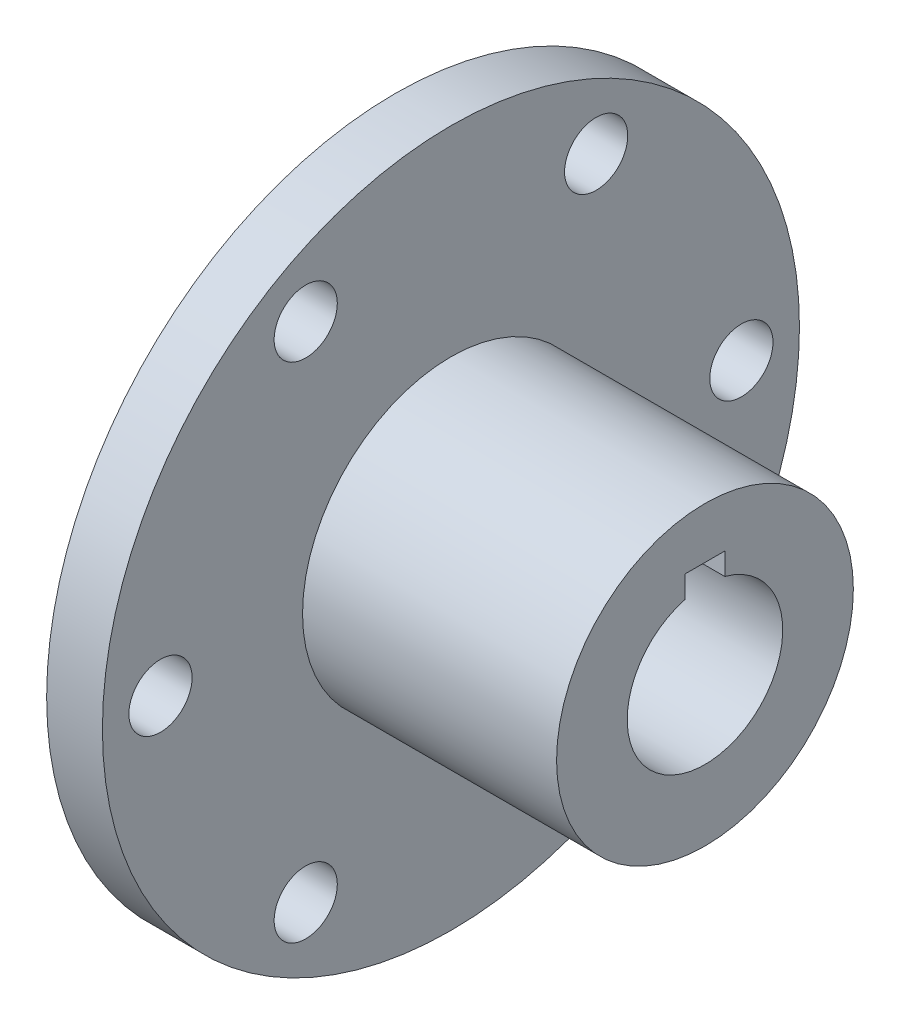
ISO-10303-21;
HEADER;
FILE_DESCRIPTION(('STEP AP214'),'2;1');
FILE_NAME('part.step','',(''),(''),'','','');
FILE_SCHEMA(('AUTOMOTIVE_DESIGN { 1 0 10303 214 1 1 1 1 }'));
ENDSEC;
DATA;
#1=APPLICATION_CONTEXT('core data for automotive mechanical design processes');
#2=APPLICATION_PROTOCOL_DEFINITION('international standard','automotive_design',2000,#1);
#3=PRODUCT_CONTEXT('',#1,'mechanical');
#4=PRODUCT('Part','Part','',(#3));
#5=PRODUCT_RELATED_PRODUCT_CATEGORY('part','',(#4));
#6=PRODUCT_DEFINITION_FORMATION('','',#4);
#7=PRODUCT_DEFINITION_CONTEXT('part definition',#1,'design');
#8=PRODUCT_DEFINITION('design','',#6,#7);
#9=PRODUCT_DEFINITION_SHAPE('','',#8);
#10=(LENGTH_UNIT() NAMED_UNIT(*) SI_UNIT(.MILLI.,.METRE.));
#11=(NAMED_UNIT(*) PLANE_ANGLE_UNIT() SI_UNIT($,.RADIAN.));
#12=(NAMED_UNIT(*) SI_UNIT($,.STERADIAN.) SOLID_ANGLE_UNIT());
#13=UNCERTAINTY_MEASURE_WITH_UNIT(LENGTH_MEASURE(1.E-05),#10,'distance_accuracy_value','');
#14=(GEOMETRIC_REPRESENTATION_CONTEXT(3) GLOBAL_UNCERTAINTY_ASSIGNED_CONTEXT((#13)) GLOBAL_UNIT_ASSIGNED_CONTEXT((#10,
#11,#12)) REPRESENTATION_CONTEXT('',''));
#15=CARTESIAN_POINT('',(0.,0.,0.));
#16=DIRECTION('',(0.,0.,1.));
#17=DIRECTION('',(1.,0.,0.));
#18=AXIS2_PLACEMENT_3D('',#15,#16,#17);
#19=CARTESIAN_POINT('',(-13.0350662460568,0.,0.));
#20=DIRECTION('',(1.,0.,0.));
#21=DIRECTION('',(0.,0.,-1.));
#22=AXIS2_PLACEMENT_3D('',#19,#20,#21);
#23=PLANE('',#22);
#24=CARTESIAN_POINT('',(-13.0350662460568,0.,23.8125));
#25=DIRECTION('',(1.,0.,0.));
#26=DIRECTION('',(0.,0.,-1.));
#27=AXIS2_PLACEMENT_3D('',#24,#25,#26);
#28=CIRCLE('',#27,2.59080000000001);
#29=CARTESIAN_POINT('',(-13.0350662460568,0.,21.2217));
#30=VERTEX_POINT('',#29);
#31=EDGE_CURVE('E181',#30,#30,#28,.T.);
#32=ORIENTED_EDGE('',*,*,#31,.F.);
#33=EDGE_LOOP('',(#32));
#34=FACE_BOUND('',#33,.T.);
#35=CARTESIAN_POINT('',(-13.0350662460568,20.6222299276169,11.90625));
#36=DIRECTION('',(1.,0.,0.));
#37=DIRECTION('',(0.,0.,-1.));
#38=AXIS2_PLACEMENT_3D('',#35,#36,#37);
#39=CIRCLE('',#38,2.59080000000001);
#40=CARTESIAN_POINT('',(-13.0350662460568,20.6222299276169,9.31544999999999));
#41=VERTEX_POINT('',#40);
#42=EDGE_CURVE('E191',#41,#41,#39,.T.);
#43=ORIENTED_EDGE('',*,*,#42,.F.);
#44=EDGE_LOOP('',(#43));
#45=FACE_BOUND('',#44,.T.);
#46=CARTESIAN_POINT('',(-13.0350662460568,20.6222299276169,-11.90625));
#47=DIRECTION('',(1.,0.,0.));
#48=DIRECTION('',(0.,0.,-1.));
#49=AXIS2_PLACEMENT_3D('',#46,#47,#48);
#50=CIRCLE('',#49,2.59080000000001);
#51=CARTESIAN_POINT('',(-13.0350662460568,20.6222299276169,-14.49705));
#52=VERTEX_POINT('',#51);
#53=EDGE_CURVE('E197',#52,#52,#50,.T.);
#54=ORIENTED_EDGE('',*,*,#53,.F.);
#55=EDGE_LOOP('',(#54));
#56=FACE_BOUND('',#55,.T.);
#57=CARTESIAN_POINT('',(-13.0350662460568,0.,-23.8125));
#58=DIRECTION('',(1.,0.,0.));
#59=DIRECTION('',(0.,0.,-1.));
#60=AXIS2_PLACEMENT_3D('',#57,#58,#59);
#61=CIRCLE('',#60,2.59080000000001);
#62=CARTESIAN_POINT('',(-13.0350662460568,0.,-26.4033));
#63=VERTEX_POINT('',#62);
#64=EDGE_CURVE('E203',#63,#63,#61,.T.);
#65=ORIENTED_EDGE('',*,*,#64,.F.);
#66=EDGE_LOOP('',(#65));
#67=FACE_BOUND('',#66,.T.);
#68=CARTESIAN_POINT('',(-13.0350662460568,-20.6222299276169,-11.90625));
#69=DIRECTION('',(1.,0.,0.));
#70=DIRECTION('',(0.,0.,-1.));
#71=AXIS2_PLACEMENT_3D('',#68,#69,#70);
#72=CIRCLE('',#71,2.59080000000001);
#73=CARTESIAN_POINT('',(-13.0350662460568,-20.6222299276169,-14.49705));
#74=VERTEX_POINT('',#73);
#75=EDGE_CURVE('E209',#74,#74,#72,.T.);
#76=ORIENTED_EDGE('',*,*,#75,.F.);
#77=EDGE_LOOP('',(#76));
#78=FACE_BOUND('',#77,.T.);
#79=CARTESIAN_POINT('',(-13.0350662460568,-20.6222299276169,11.90625));
#80=DIRECTION('',(1.,0.,0.));
#81=DIRECTION('',(0.,0.,-1.));
#82=AXIS2_PLACEMENT_3D('',#79,#80,#81);
#83=CIRCLE('',#82,2.59080000000001);
#84=CARTESIAN_POINT('',(-13.0350662460568,-20.6222299276169,9.31544999999996));
#85=VERTEX_POINT('',#84);
#86=EDGE_CURVE('E93',#85,#85,#83,.T.);
#87=ORIENTED_EDGE('',*,*,#86,.F.);
#88=EDGE_LOOP('',(#87));
#89=FACE_BOUND('',#88,.T.);
#90=CARTESIAN_POINT('',(-13.0350662460568,0.,0.));
#91=DIRECTION('',(1.,0.,0.));
#92=DIRECTION('',(0.,0.,-1.));
#93=AXIS2_PLACEMENT_3D('',#90,#91,#92);
#94=CIRCLE('',#93,28.575);
#95=CARTESIAN_POINT('',(-13.0350662460568,0.,-28.575));
#96=VERTEX_POINT('',#95);
#97=EDGE_CURVE('E42',#96,#96,#94,.T.);
#98=ORIENTED_EDGE('',*,*,#97,.T.);
#99=EDGE_LOOP('',(#98));
#100=FACE_BOUND('',#99,.T.);
#101=CARTESIAN_POINT('',(-13.0350662460568,0.,0.));
#102=DIRECTION('',(1.,0.,0.));
#103=DIRECTION('',(0.,0.,-1.));
#104=AXIS2_PLACEMENT_3D('',#101,#102,#103);
#105=CIRCLE('',#104,12.1666);
#106=CARTESIAN_POINT('',(-13.0350662460568,0.,-12.1666));
#107=VERTEX_POINT('',#106);
#108=EDGE_CURVE('E81',#107,#107,#105,.T.);
#109=ORIENTED_EDGE('',*,*,#108,.F.);
#110=EDGE_LOOP('',(#109));
#111=FACE_BOUND('',#110,.T.);
#112=ADVANCED_FACE('F34',(#34,#45,#56,#67,#78,#89,#100,#111),#23,.T.);
#113=CARTESIAN_POINT('',(-17.6070662460568,0.,0.));
#114=DIRECTION('',(1.,0.,0.));
#115=DIRECTION('',(0.,0.,-1.));
#116=AXIS2_PLACEMENT_3D('',#113,#114,#115);
#117=CYLINDRICAL_SURFACE('',#116,28.575);
#118=CARTESIAN_POINT('',(-17.6070662460568,0.,0.));
#119=DIRECTION('',(1.,0.,0.));
#120=DIRECTION('',(0.,0.,-1.));
#121=AXIS2_PLACEMENT_3D('',#118,#119,#120);
#122=CIRCLE('',#121,28.575);
#123=CARTESIAN_POINT('',(-17.6070662460568,0.,-28.575));
#124=VERTEX_POINT('',#123);
#125=EDGE_CURVE('E11',#124,#124,#122,.T.);
#126=ORIENTED_EDGE('',*,*,#125,.T.);
#127=EDGE_LOOP('',(#126));
#128=FACE_BOUND('',#127,.T.);
#129=ORIENTED_EDGE('',*,*,#97,.F.);
#130=EDGE_LOOP('',(#129));
#131=FACE_BOUND('',#130,.T.);
#132=ADVANCED_FACE('F36',(#128,#131),#117,.T.);
#133=CARTESIAN_POINT('',(-17.6070662460568,28.575,0.));
#134=DIRECTION('',(-1.,0.,0.));
#135=DIRECTION('',(0.,0.,1.));
#136=AXIS2_PLACEMENT_3D('',#133,#134,#135);
#137=PLANE('',#136);
#138=CARTESIAN_POINT('',(-17.6070662460568,0.,23.8125));
#139=DIRECTION('',(-1.,0.,0.));
#140=DIRECTION('',(0.,0.,1.));
#141=AXIS2_PLACEMENT_3D('',#138,#139,#140);
#142=CIRCLE('',#141,2.59080000000001);
#143=CARTESIAN_POINT('',(-17.6070662460568,0.,26.4033));
#144=VERTEX_POINT('',#143);
#145=EDGE_CURVE('E184',#144,#144,#142,.T.);
#146=ORIENTED_EDGE('',*,*,#145,.F.);
#147=EDGE_LOOP('',(#146));
#148=FACE_BOUND('',#147,.T.);
#149=CARTESIAN_POINT('',(-17.6070662460568,20.6222299276169,11.90625));
#150=DIRECTION('',(-1.,0.,0.));
#151=DIRECTION('',(0.,0.,1.));
#152=AXIS2_PLACEMENT_3D('',#149,#150,#151);
#153=CIRCLE('',#152,2.59080000000001);
#154=CARTESIAN_POINT('',(-17.6070662460568,20.6222299276169,14.49705));
#155=VERTEX_POINT('',#154);
#156=EDGE_CURVE('E186',#155,#155,#153,.T.);
#157=ORIENTED_EDGE('',*,*,#156,.F.);
#158=EDGE_LOOP('',(#157));
#159=FACE_BOUND('',#158,.T.);
#160=CARTESIAN_POINT('',(-17.6070662460568,20.6222299276169,-11.90625));
#161=DIRECTION('',(-1.,0.,0.));
#162=DIRECTION('',(0.,0.,1.));
#163=AXIS2_PLACEMENT_3D('',#160,#161,#162);
#164=CIRCLE('',#163,2.59080000000001);
#165=CARTESIAN_POINT('',(-17.6070662460568,20.6222299276169,-9.31544999999999));
#166=VERTEX_POINT('',#165);
#167=EDGE_CURVE('E194',#166,#166,#164,.T.);
#168=ORIENTED_EDGE('',*,*,#167,.F.);
#169=EDGE_LOOP('',(#168));
#170=FACE_BOUND('',#169,.T.);
#171=CARTESIAN_POINT('',(-17.6070662460568,0.,-23.8125));
#172=DIRECTION('',(-1.,0.,0.));
#173=DIRECTION('',(0.,0.,1.));
#174=AXIS2_PLACEMENT_3D('',#171,#172,#173);
#175=CIRCLE('',#174,2.59080000000001);
#176=CARTESIAN_POINT('',(-17.6070662460568,0.,-21.2217));
#177=VERTEX_POINT('',#176);
#178=EDGE_CURVE('E200',#177,#177,#175,.T.);
#179=ORIENTED_EDGE('',*,*,#178,.F.);
#180=EDGE_LOOP('',(#179));
#181=FACE_BOUND('',#180,.T.);
#182=CARTESIAN_POINT('',(-17.6070662460568,-20.6222299276169,-11.90625));
#183=DIRECTION('',(-1.,0.,0.));
#184=DIRECTION('',(0.,0.,1.));
#185=AXIS2_PLACEMENT_3D('',#182,#183,#184);
#186=CIRCLE('',#185,2.59080000000001);
#187=CARTESIAN_POINT('',(-17.6070662460568,-20.6222299276169,-9.31544999999999));
#188=VERTEX_POINT('',#187);
#189=EDGE_CURVE('E206',#188,#188,#186,.T.);
#190=ORIENTED_EDGE('',*,*,#189,.F.);
#191=EDGE_LOOP('',(#190));
#192=FACE_BOUND('',#191,.T.);
#193=CARTESIAN_POINT('',(-17.6070662460568,-20.6222299276169,11.90625));
#194=DIRECTION('',(-1.,0.,0.));
#195=DIRECTION('',(0.,0.,1.));
#196=AXIS2_PLACEMENT_3D('',#193,#194,#195);
#197=CIRCLE('',#196,2.59080000000001);
#198=CARTESIAN_POINT('',(-17.6070662460568,-20.6222299276169,14.49705));
#199=VERTEX_POINT('',#198);
#200=EDGE_CURVE('E212',#199,#199,#197,.T.);
#201=ORIENTED_EDGE('',*,*,#200,.F.);
#202=EDGE_LOOP('',(#201));
#203=FACE_BOUND('',#202,.T.);
#204=CARTESIAN_POINT('',(-17.6070662460568,0.,0.));
#205=DIRECTION('',(-1.,0.,0.));
#206=DIRECTION('',(0.,0.,1.));
#207=AXIS2_PLACEMENT_3D('',#204,#205,#206);
#208=CIRCLE('',#207,6.3754);
#209=CARTESIAN_POINT('',(-17.6070662460568,6.16466948019113,-1.6256));
#210=VERTEX_POINT('',#209);
#211=CARTESIAN_POINT('',(-17.6070662460568,6.16466948019113,1.6256));
#212=VERTEX_POINT('',#211);
#213=EDGE_CURVE('E49',#210,#212,#208,.T.);
#214=ORIENTED_EDGE('',*,*,#213,.F.);
#215=DIRECTION('',(0.,-1.,0.));
#216=VECTOR('',#215,1.);
#217=CARTESIAN_POINT('',(-17.6070662460568,7.9756,-1.6256));
#218=LINE('',#217,#216);
#219=CARTESIAN_POINT('',(-17.6070662460568,7.9756,-1.6256));
#220=VERTEX_POINT('',#219);
#221=EDGE_CURVE('E90',#220,#210,#218,.T.);
#222=ORIENTED_EDGE('',*,*,#221,.F.);
#223=DIRECTION('',(0.,0.,-1.));
#224=VECTOR('',#223,1.);
#225=CARTESIAN_POINT('',(-17.6070662460568,7.9756,1.6256));
#226=LINE('',#225,#224);
#227=CARTESIAN_POINT('',(-17.6070662460568,7.9756,1.6256));
#228=VERTEX_POINT('',#227);
#229=EDGE_CURVE('E98',#228,#220,#226,.T.);
#230=ORIENTED_EDGE('',*,*,#229,.F.);
#231=DIRECTION('',(0.,1.,0.));
#232=VECTOR('',#231,1.);
#233=CARTESIAN_POINT('',(-17.6070662460568,6.16466948019113,1.6256));
#234=LINE('',#233,#232);
#235=EDGE_CURVE('E92',#212,#228,#234,.T.);
#236=ORIENTED_EDGE('',*,*,#235,.F.);
#237=EDGE_LOOP('',(#214,#222,#230,#236));
#238=FACE_BOUND('',#237,.T.);
#239=ORIENTED_EDGE('',*,*,#125,.F.);
#240=EDGE_LOOP('',(#239));
#241=FACE_BOUND('',#240,.T.);
#242=ADVANCED_FACE('F87',(#148,#159,#170,#181,#192,#203,#238,#241),#137,.T.);
#243=CARTESIAN_POINT('',(7.79293375394323,0.,0.));
#244=DIRECTION('',(-1.,0.,0.));
#245=DIRECTION('',(0.,0.,1.));
#246=AXIS2_PLACEMENT_3D('',#243,#244,#245);
#247=CYLINDRICAL_SURFACE('',#246,12.1666);
#248=CARTESIAN_POINT('',(7.79293375394323,0.,0.));
#249=DIRECTION('',(1.,0.,0.));
#250=DIRECTION('',(0.,0.,-1.));
#251=AXIS2_PLACEMENT_3D('',#248,#249,#250);
#252=CIRCLE('',#251,12.1666);
#253=CARTESIAN_POINT('',(7.79293375394323,0.,-12.1666));
#254=VERTEX_POINT('',#253);
#255=EDGE_CURVE('E111',#254,#254,#252,.T.);
#256=ORIENTED_EDGE('',*,*,#255,.F.);
#257=EDGE_LOOP('',(#256));
#258=FACE_BOUND('',#257,.T.);
#259=ORIENTED_EDGE('',*,*,#108,.T.);
#260=EDGE_LOOP('',(#259));
#261=FACE_BOUND('',#260,.T.);
#262=ADVANCED_FACE('F126',(#258,#261),#247,.T.);
#263=CARTESIAN_POINT('',(7.79293375394323,0.,0.));
#264=DIRECTION('',(1.,0.,0.));
#265=DIRECTION('',(0.,0.,-1.));
#266=AXIS2_PLACEMENT_3D('',#263,#264,#265);
#267=PLANE('',#266);
#268=CARTESIAN_POINT('',(7.79293375394323,0.,0.));
#269=DIRECTION('',(-1.,0.,0.));
#270=DIRECTION('',(0.,0.,1.));
#271=AXIS2_PLACEMENT_3D('',#268,#269,#270);
#272=CIRCLE('',#271,6.3754);
#273=CARTESIAN_POINT('',(7.79293375394323,6.16466948019113,-1.6256));
#274=VERTEX_POINT('',#273);
#275=CARTESIAN_POINT('',(7.79293375394323,6.16466948019113,1.6256));
#276=VERTEX_POINT('',#275);
#277=EDGE_CURVE('E76',#274,#276,#272,.T.);
#278=ORIENTED_EDGE('',*,*,#277,.T.);
#279=DIRECTION('',(0.,1.,0.));
#280=VECTOR('',#279,1.);
#281=CARTESIAN_POINT('',(7.79293375394323,6.16466948019113,1.6256));
#282=LINE('',#281,#280);
#283=CARTESIAN_POINT('',(7.79293375394323,7.9756,1.6256));
#284=VERTEX_POINT('',#283);
#285=EDGE_CURVE('E97',#276,#284,#282,.T.);
#286=ORIENTED_EDGE('',*,*,#285,.T.);
#287=DIRECTION('',(0.,0.,-1.));
#288=VECTOR('',#287,1.);
#289=CARTESIAN_POINT('',(7.79293375394323,7.9756,1.6256));
#290=LINE('',#289,#288);
#291=CARTESIAN_POINT('',(7.79293375394323,7.9756,-1.6256));
#292=VERTEX_POINT('',#291);
#293=EDGE_CURVE('E57',#284,#292,#290,.T.);
#294=ORIENTED_EDGE('',*,*,#293,.T.);
#295=DIRECTION('',(0.,-1.,0.));
#296=VECTOR('',#295,1.);
#297=CARTESIAN_POINT('',(7.79293375394323,7.9756,-1.6256));
#298=LINE('',#297,#296);
#299=EDGE_CURVE('E110',#292,#274,#298,.T.);
#300=ORIENTED_EDGE('',*,*,#299,.T.);
#301=EDGE_LOOP('',(#278,#286,#294,#300));
#302=FACE_BOUND('',#301,.T.);
#303=ORIENTED_EDGE('',*,*,#255,.T.);
#304=EDGE_LOOP('',(#303));
#305=FACE_BOUND('',#304,.T.);
#306=ADVANCED_FACE('F138',(#302,#305),#267,.T.);
#307=CARTESIAN_POINT('',(7.79293375394323,7.9756,-1.6256));
#308=DIRECTION('',(0.,0.,-1.));
#309=DIRECTION('',(0.,1.,0.));
#310=AXIS2_PLACEMENT_3D('',#307,#308,#309);
#311=PLANE('',#310);
#312=ORIENTED_EDGE('',*,*,#221,.T.);
#313=DIRECTION('',(-1.,0.,0.));
#314=VECTOR('',#313,1.);
#315=CARTESIAN_POINT('',(7.79293375394323,6.16466948019113,-1.6256));
#316=LINE('',#315,#314);
#317=EDGE_CURVE('E73',#274,#210,#316,.T.);
#318=ORIENTED_EDGE('',*,*,#317,.F.);
#319=ORIENTED_EDGE('',*,*,#299,.F.);
#320=DIRECTION('',(-1.,0.,0.));
#321=VECTOR('',#320,1.);
#322=CARTESIAN_POINT('',(7.79293375394323,7.9756,-1.6256));
#323=LINE('',#322,#321);
#324=EDGE_CURVE('E82',#292,#220,#323,.T.);
#325=ORIENTED_EDGE('',*,*,#324,.T.);
#326=EDGE_LOOP('',(#312,#318,#319,#325));
#327=FACE_BOUND('',#326,.T.);
#328=ADVANCED_FACE('F95',(#327),#311,.F.);
#329=CARTESIAN_POINT('',(7.79293375394323,7.9756,1.6256));
#330=DIRECTION('',(0.,1.,0.));
#331=DIRECTION('',(0.,0.,1.));
#332=AXIS2_PLACEMENT_3D('',#329,#330,#331);
#333=PLANE('',#332);
#334=ORIENTED_EDGE('',*,*,#229,.T.);
#335=ORIENTED_EDGE('',*,*,#324,.F.);
#336=ORIENTED_EDGE('',*,*,#293,.F.);
#337=DIRECTION('',(-1.,0.,0.));
#338=VECTOR('',#337,1.);
#339=CARTESIAN_POINT('',(7.79293375394323,7.9756,1.6256));
#340=LINE('',#339,#338);
#341=EDGE_CURVE('E106',#284,#228,#340,.T.);
#342=ORIENTED_EDGE('',*,*,#341,.T.);
#343=EDGE_LOOP('',(#334,#335,#336,#342));
#344=FACE_BOUND('',#343,.T.);
#345=ADVANCED_FACE('F146',(#344),#333,.F.);
#346=CARTESIAN_POINT('',(7.79293375394323,6.16466948019113,1.6256));
#347=DIRECTION('',(0.,0.,1.));
#348=DIRECTION('',(0.,-1.,0.));
#349=AXIS2_PLACEMENT_3D('',#346,#347,#348);
#350=PLANE('',#349);
#351=ORIENTED_EDGE('',*,*,#235,.T.);
#352=ORIENTED_EDGE('',*,*,#341,.F.);
#353=ORIENTED_EDGE('',*,*,#285,.F.);
#354=DIRECTION('',(-1.,0.,0.));
#355=VECTOR('',#354,1.);
#356=CARTESIAN_POINT('',(7.79293375394323,6.16466948019113,1.6256));
#357=LINE('',#356,#355);
#358=EDGE_CURVE('E108',#276,#212,#357,.T.);
#359=ORIENTED_EDGE('',*,*,#358,.T.);
#360=EDGE_LOOP('',(#351,#352,#353,#359));
#361=FACE_BOUND('',#360,.T.);
#362=ADVANCED_FACE('F143',(#361),#350,.F.);
#363=CARTESIAN_POINT('',(7.79293375394323,0.,0.));
#364=DIRECTION('',(-1.,0.,0.));
#365=DIRECTION('',(0.,0.,1.));
#366=AXIS2_PLACEMENT_3D('',#363,#364,#365);
#367=CYLINDRICAL_SURFACE('',#366,6.3754);
#368=ORIENTED_EDGE('',*,*,#213,.T.);
#369=ORIENTED_EDGE('',*,*,#358,.F.);
#370=ORIENTED_EDGE('',*,*,#277,.F.);
#371=ORIENTED_EDGE('',*,*,#317,.T.);
#372=EDGE_LOOP('',(#368,#369,#370,#371));
#373=FACE_BOUND('',#372,.T.);
#374=ADVANCED_FACE('F74',(#373),#367,.F.);
#375=CARTESIAN_POINT('',(-17.6070662460568,-20.6222299276169,11.90625));
#376=DIRECTION('',(-1.,0.,0.));
#377=DIRECTION('',(0.,0.,1.));
#378=AXIS2_PLACEMENT_3D('',#375,#376,#377);
#379=CYLINDRICAL_SURFACE('',#378,2.59080000000001);
#380=ORIENTED_EDGE('',*,*,#86,.T.);
#381=EDGE_LOOP('',(#380));
#382=FACE_BOUND('',#381,.T.);
#383=ORIENTED_EDGE('',*,*,#200,.T.);
#384=EDGE_LOOP('',(#383));
#385=FACE_BOUND('',#384,.T.);
#386=ADVANCED_FACE('F154',(#382,#385),#379,.F.);
#387=CARTESIAN_POINT('',(-17.6070662460568,-20.6222299276169,-11.90625));
#388=DIRECTION('',(-1.,0.,0.));
#389=DIRECTION('',(0.,0.,1.));
#390=AXIS2_PLACEMENT_3D('',#387,#388,#389);
#391=CYLINDRICAL_SURFACE('',#390,2.59080000000001);
#392=ORIENTED_EDGE('',*,*,#75,.T.);
#393=EDGE_LOOP('',(#392));
#394=FACE_BOUND('',#393,.T.);
#395=ORIENTED_EDGE('',*,*,#189,.T.);
#396=EDGE_LOOP('',(#395));
#397=FACE_BOUND('',#396,.T.);
#398=ADVANCED_FACE('F157',(#394,#397),#391,.F.);
#399=CARTESIAN_POINT('',(-17.6070662460568,0.,-23.8125));
#400=DIRECTION('',(-1.,0.,0.));
#401=DIRECTION('',(0.,0.,1.));
#402=AXIS2_PLACEMENT_3D('',#399,#400,#401);
#403=CYLINDRICAL_SURFACE('',#402,2.59080000000001);
#404=ORIENTED_EDGE('',*,*,#64,.T.);
#405=EDGE_LOOP('',(#404));
#406=FACE_BOUND('',#405,.T.);
#407=ORIENTED_EDGE('',*,*,#178,.T.);
#408=EDGE_LOOP('',(#407));
#409=FACE_BOUND('',#408,.T.);
#410=ADVANCED_FACE('F161',(#406,#409),#403,.F.);
#411=CARTESIAN_POINT('',(-17.6070662460568,20.6222299276169,-11.90625));
#412=DIRECTION('',(-1.,0.,0.));
#413=DIRECTION('',(0.,0.,1.));
#414=AXIS2_PLACEMENT_3D('',#411,#412,#413);
#415=CYLINDRICAL_SURFACE('',#414,2.59080000000001);
#416=ORIENTED_EDGE('',*,*,#53,.T.);
#417=EDGE_LOOP('',(#416));
#418=FACE_BOUND('',#417,.T.);
#419=ORIENTED_EDGE('',*,*,#167,.T.);
#420=EDGE_LOOP('',(#419));
#421=FACE_BOUND('',#420,.T.);
#422=ADVANCED_FACE('F165',(#418,#421),#415,.F.);
#423=CARTESIAN_POINT('',(-17.6070662460568,20.6222299276169,11.90625));
#424=DIRECTION('',(-1.,0.,0.));
#425=DIRECTION('',(0.,0.,1.));
#426=AXIS2_PLACEMENT_3D('',#423,#424,#425);
#427=CYLINDRICAL_SURFACE('',#426,2.59080000000001);
#428=ORIENTED_EDGE('',*,*,#42,.T.);
#429=EDGE_LOOP('',(#428));
#430=FACE_BOUND('',#429,.T.);
#431=ORIENTED_EDGE('',*,*,#156,.T.);
#432=EDGE_LOOP('',(#431));
#433=FACE_BOUND('',#432,.T.);
#434=ADVANCED_FACE('F169',(#430,#433),#427,.F.);
#435=CARTESIAN_POINT('',(-17.6070662460568,0.,23.8125));
#436=DIRECTION('',(-1.,0.,0.));
#437=DIRECTION('',(0.,0.,1.));
#438=AXIS2_PLACEMENT_3D('',#435,#436,#437);
#439=CYLINDRICAL_SURFACE('',#438,2.59080000000001);
#440=ORIENTED_EDGE('',*,*,#31,.T.);
#441=EDGE_LOOP('',(#440));
#442=FACE_BOUND('',#441,.T.);
#443=ORIENTED_EDGE('',*,*,#145,.T.);
#444=EDGE_LOOP('',(#443));
#445=FACE_BOUND('',#444,.T.);
#446=ADVANCED_FACE('F173',(#442,#445),#439,.F.);
#447=CLOSED_SHELL('',(#112,#132,#242,#262,#306,#328,#345,#362,#374,#386,#398,#410,#422,#434,#446));
#448=MANIFOLD_SOLID_BREP('B2',#447);
#449=ADVANCED_BREP_SHAPE_REPRESENTATION('',(#18,#448),#14);
#450=SHAPE_DEFINITION_REPRESENTATION(#9,#449);
ENDSEC;
END-ISO-10303-21;
